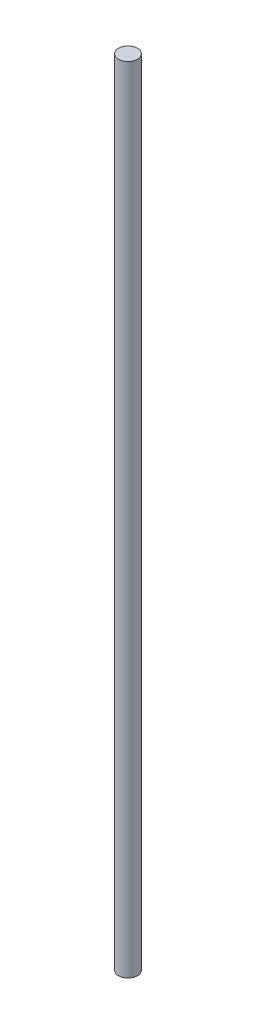
ISO-10303-21;
HEADER;
FILE_DESCRIPTION(('STEP AP214'),'2;1');
FILE_NAME('part.step','',(''),(''),'','','');
FILE_SCHEMA(('AUTOMOTIVE_DESIGN { 1 0 10303 214 1 1 1 1 }'));
ENDSEC;
DATA;
#1=APPLICATION_CONTEXT('core data for automotive mechanical design processes');
#2=APPLICATION_PROTOCOL_DEFINITION('international standard','automotive_design',2000,#1);
#3=PRODUCT_CONTEXT('',#1,'mechanical');
#4=PRODUCT('Part','Part','',(#3));
#5=PRODUCT_RELATED_PRODUCT_CATEGORY('part','',(#4));
#6=PRODUCT_DEFINITION_FORMATION('','',#4);
#7=PRODUCT_DEFINITION_CONTEXT('part definition',#1,'design');
#8=PRODUCT_DEFINITION('design','',#6,#7);
#9=PRODUCT_DEFINITION_SHAPE('','',#8);
#10=(LENGTH_UNIT() NAMED_UNIT(*) SI_UNIT(.MILLI.,.METRE.));
#11=(NAMED_UNIT(*) PLANE_ANGLE_UNIT() SI_UNIT($,.RADIAN.));
#12=(NAMED_UNIT(*) SI_UNIT($,.STERADIAN.) SOLID_ANGLE_UNIT());
#13=UNCERTAINTY_MEASURE_WITH_UNIT(LENGTH_MEASURE(1.E-05),#10,'distance_accuracy_value','');
#14=(GEOMETRIC_REPRESENTATION_CONTEXT(3) GLOBAL_UNCERTAINTY_ASSIGNED_CONTEXT((#13)) GLOBAL_UNIT_ASSIGNED_CONTEXT((#10,
#11,#12)) REPRESENTATION_CONTEXT('',''));
#15=CARTESIAN_POINT('',(0.,0.,0.));
#16=DIRECTION('',(0.,0.,1.));
#17=DIRECTION('',(1.,0.,0.));
#18=AXIS2_PLACEMENT_3D('',#15,#16,#17);
#19=CARTESIAN_POINT('',(0.,125.,0.));
#20=DIRECTION('',(0.,-1.,0.));
#21=DIRECTION('',(0.,0.,-1.));
#22=AXIS2_PLACEMENT_3D('',#19,#20,#21);
#23=CYLINDRICAL_SURFACE('',#22,1.5);
#24=CARTESIAN_POINT('',(0.,125.,0.));
#25=DIRECTION('',(0.,1.,0.));
#26=DIRECTION('',(0.,0.,1.));
#27=AXIS2_PLACEMENT_3D('',#24,#25,#26);
#28=CIRCLE('',#27,1.5);
#29=CARTESIAN_POINT('',(0.,125.,1.5));
#30=VERTEX_POINT('',#29);
#31=EDGE_CURVE('E10',#30,#30,#28,.T.);
#32=ORIENTED_EDGE('',*,*,#31,.F.);
#33=EDGE_LOOP('',(#32));
#34=FACE_BOUND('',#33,.T.);
#35=CARTESIAN_POINT('',(0.,0.,0.));
#36=DIRECTION('',(0.,1.,0.));
#37=DIRECTION('',(0.,0.,1.));
#38=AXIS2_PLACEMENT_3D('',#35,#36,#37);
#39=CIRCLE('',#38,1.5);
#40=CARTESIAN_POINT('',(0.,0.,1.5));
#41=VERTEX_POINT('',#40);
#42=EDGE_CURVE('E43',#41,#41,#39,.T.);
#43=ORIENTED_EDGE('',*,*,#42,.T.);
#44=EDGE_LOOP('',(#43));
#45=FACE_BOUND('',#44,.T.);
#46=ADVANCED_FACE('F40',(#34,#45),#23,.T.);
#47=CARTESIAN_POINT('',(0.,125.,0.));
#48=DIRECTION('',(0.,1.,0.));
#49=DIRECTION('',(0.,0.,1.));
#50=AXIS2_PLACEMENT_3D('',#47,#48,#49);
#51=PLANE('',#50);
#52=ORIENTED_EDGE('',*,*,#31,.T.);
#53=EDGE_LOOP('',(#52));
#54=FACE_BOUND('',#53,.T.);
#55=ADVANCED_FACE('F55',(#54),#51,.T.);
#56=CARTESIAN_POINT('',(0.,0.,0.));
#57=DIRECTION('',(0.,1.,0.));
#58=DIRECTION('',(0.,0.,1.));
#59=AXIS2_PLACEMENT_3D('',#56,#57,#58);
#60=PLANE('',#59);
#61=ORIENTED_EDGE('',*,*,#42,.F.);
#62=EDGE_LOOP('',(#61));
#63=FACE_BOUND('',#62,.T.);
#64=ADVANCED_FACE('F53',(#63),#60,.F.);
#65=CLOSED_SHELL('',(#46,#55,#64));
#66=MANIFOLD_SOLID_BREP('B2',#65);
#67=ADVANCED_BREP_SHAPE_REPRESENTATION('',(#18,#66),#14);
#68=SHAPE_DEFINITION_REPRESENTATION(#9,#67);
ENDSEC;
END-ISO-10303-21;
